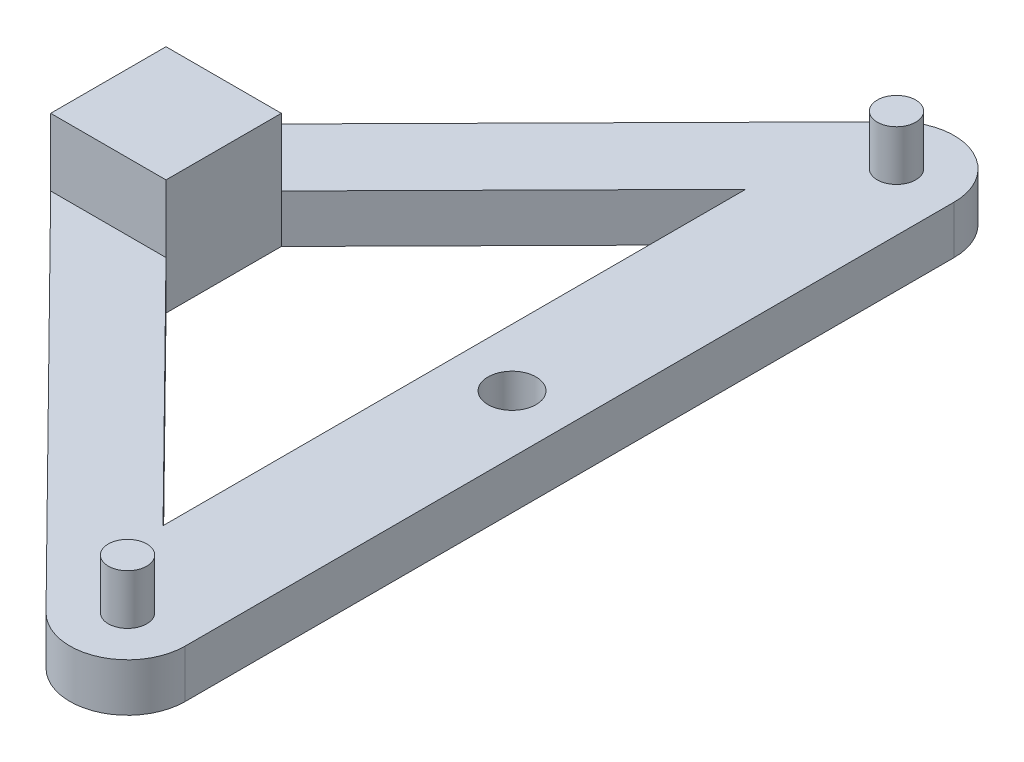
ISO-10303-21;
HEADER;
FILE_DESCRIPTION(('STEP AP214'),'2;1');
FILE_NAME('part.step','',(''),(''),'','','');
FILE_SCHEMA(('AUTOMOTIVE_DESIGN { 1 0 10303 214 1 1 1 1 }'));
ENDSEC;
DATA;
#1=APPLICATION_CONTEXT('core data for automotive mechanical design processes');
#2=APPLICATION_PROTOCOL_DEFINITION('international standard','automotive_design',2000,#1);
#3=PRODUCT_CONTEXT('',#1,'mechanical');
#4=PRODUCT('Part','Part','',(#3));
#5=PRODUCT_RELATED_PRODUCT_CATEGORY('part','',(#4));
#6=PRODUCT_DEFINITION_FORMATION('','',#4);
#7=PRODUCT_DEFINITION_CONTEXT('part definition',#1,'design');
#8=PRODUCT_DEFINITION('design','',#6,#7);
#9=PRODUCT_DEFINITION_SHAPE('','',#8);
#10=(LENGTH_UNIT() NAMED_UNIT(*) SI_UNIT(.MILLI.,.METRE.));
#11=(NAMED_UNIT(*) PLANE_ANGLE_UNIT() SI_UNIT($,.RADIAN.));
#12=(NAMED_UNIT(*) SI_UNIT($,.STERADIAN.) SOLID_ANGLE_UNIT());
#13=UNCERTAINTY_MEASURE_WITH_UNIT(LENGTH_MEASURE(1.E-05),#10,'distance_accuracy_value','');
#14=(GEOMETRIC_REPRESENTATION_CONTEXT(3) GLOBAL_UNCERTAINTY_ASSIGNED_CONTEXT((#13)) GLOBAL_UNIT_ASSIGNED_CONTEXT((#10,
#11,#12)) REPRESENTATION_CONTEXT('',''));
#15=CARTESIAN_POINT('',(0.,0.,0.));
#16=DIRECTION('',(0.,0.,1.));
#17=DIRECTION('',(1.,0.,0.));
#18=AXIS2_PLACEMENT_3D('',#15,#16,#17);
#19=CARTESIAN_POINT('',(-19.05,3.175,3.81));
#20=DIRECTION('',(-0.711608950399064,0.,0.702575762257667));
#21=DIRECTION('',(0.702575762257667,0.,0.711608950399064));
#22=AXIS2_PLACEMENT_3D('',#19,#20,#21);
#23=PLANE('',#22);
#24=DIRECTION('',(-0.702575762257667,0.,-0.711608950399064));
#25=VECTOR('',#24,1.);
#26=CARTESIAN_POINT('',(-19.05,0.,3.81));
#27=LINE('',#26,#25);
#28=CARTESIAN_POINT('',(-3.81,0.,19.245944401544));
#29=VERTEX_POINT('',#28);
#30=CARTESIAN_POINT('',(-19.05,0.,3.81));
#31=VERTEX_POINT('',#30);
#32=EDGE_CURVE('E148',#29,#31,#27,.T.);
#33=ORIENTED_EDGE('',*,*,#32,.T.);
#34=DIRECTION('',(0.,-1.,0.));
#35=VECTOR('',#34,1.);
#36=CARTESIAN_POINT('',(-19.05,3.175,3.81));
#37=LINE('',#36,#35);
#38=CARTESIAN_POINT('',(-19.05,3.175,3.81));
#39=VERTEX_POINT('',#38);
#40=EDGE_CURVE('E11',#39,#31,#37,.T.);
#41=ORIENTED_EDGE('',*,*,#40,.F.);
#42=DIRECTION('',(-0.702575762257667,0.,-0.711608950399064));
#43=VECTOR('',#42,1.);
#44=CARTESIAN_POINT('',(-19.05,3.175,3.81));
#45=LINE('',#44,#43);
#46=CARTESIAN_POINT('',(-3.81,3.175,19.245944401544));
#47=VERTEX_POINT('',#46);
#48=EDGE_CURVE('E91',#47,#39,#45,.T.);
#49=ORIENTED_EDGE('',*,*,#48,.F.);
#50=DIRECTION('',(0.,-1.,0.));
#51=VECTOR('',#50,1.);
#52=CARTESIAN_POINT('',(-3.81,3.175,19.245944401544));
#53=LINE('',#52,#51);
#54=EDGE_CURVE('E169',#47,#29,#53,.T.);
#55=ORIENTED_EDGE('',*,*,#54,.T.);
#56=EDGE_LOOP('',(#33,#41,#49,#55));
#57=FACE_BOUND('',#56,.T.);
#58=ADVANCED_FACE('F33',(#57),#23,.F.);
#59=CARTESIAN_POINT('',(-26.67,3.175,3.81));
#60=DIRECTION('',(0.711608950399064,0.,-0.702575762257667));
#61=DIRECTION('',(-0.702575762257667,0.,-0.711608950399064));
#62=AXIS2_PLACEMENT_3D('',#59,#60,#61);
#63=PLANE('',#62);
#64=DIRECTION('',(0.702575762257667,0.,0.711608950399064));
#65=VECTOR('',#64,1.);
#66=CARTESIAN_POINT('',(-26.67,0.,3.81));
#67=LINE('',#66,#65);
#68=CARTESIAN_POINT('',(-26.67,0.,3.81));
#69=VERTEX_POINT('',#68);
#70=CARTESIAN_POINT('',(-2.71123010102043,0.,28.0768136542017));
#71=VERTEX_POINT('',#70);
#72=EDGE_CURVE('E151',#69,#71,#67,.T.);
#73=ORIENTED_EDGE('',*,*,#72,.T.);
#74=DIRECTION('',(0.,-1.,0.));
#75=VECTOR('',#74,1.);
#76=CARTESIAN_POINT('',(-2.71123010102043,3.175,28.0768136542017));
#77=LINE('',#76,#75);
#78=CARTESIAN_POINT('',(-2.71123010102043,3.175,28.0768136542017));
#79=VERTEX_POINT('',#78);
#80=EDGE_CURVE('E195',#79,#71,#77,.T.);
#81=ORIENTED_EDGE('',*,*,#80,.F.);
#82=DIRECTION('',(0.702575762257667,0.,0.711608950399064));
#83=VECTOR('',#82,1.);
#84=CARTESIAN_POINT('',(-26.67,3.175,3.81));
#85=LINE('',#84,#83);
#86=CARTESIAN_POINT('',(-26.67,3.175,3.81));
#87=VERTEX_POINT('',#86);
#88=EDGE_CURVE('E160',#87,#79,#85,.T.);
#89=ORIENTED_EDGE('',*,*,#88,.F.);
#90=DIRECTION('',(0.,-1.,0.));
#91=VECTOR('',#90,1.);
#92=CARTESIAN_POINT('',(-26.67,3.175,3.81));
#93=LINE('',#92,#91);
#94=EDGE_CURVE('E41',#87,#69,#93,.T.);
#95=ORIENTED_EDGE('',*,*,#94,.T.);
#96=EDGE_LOOP('',(#73,#81,#89,#95));
#97=FACE_BOUND('',#96,.T.);
#98=ADVANCED_FACE('F202',(#97),#63,.F.);
#99=CARTESIAN_POINT('',(0.,3.175,25.4));
#100=DIRECTION('',(0.,-1.,0.));
#101=DIRECTION('',(0.,0.,-1.));
#102=AXIS2_PLACEMENT_3D('',#99,#100,#101);
#103=CYLINDRICAL_SURFACE('',#102,3.81);
#104=CARTESIAN_POINT('',(0.,0.,25.4));
#105=DIRECTION('',(0.,1.,0.));
#106=DIRECTION('',(0.,0.,1.));
#107=AXIS2_PLACEMENT_3D('',#104,#105,#106);
#108=CIRCLE('',#107,3.81);
#109=CARTESIAN_POINT('',(3.81,0.,25.4));
#110=VERTEX_POINT('',#109);
#111=EDGE_CURVE('E172',#71,#110,#108,.T.);
#112=ORIENTED_EDGE('',*,*,#111,.T.);
#113=DIRECTION('',(0.,-1.,0.));
#114=VECTOR('',#113,1.);
#115=CARTESIAN_POINT('',(3.81,3.175,25.4));
#116=LINE('',#115,#114);
#117=CARTESIAN_POINT('',(3.81,3.175,25.4));
#118=VERTEX_POINT('',#117);
#119=EDGE_CURVE('E192',#118,#110,#116,.T.);
#120=ORIENTED_EDGE('',*,*,#119,.F.);
#121=CARTESIAN_POINT('',(0.,3.175,25.4));
#122=DIRECTION('',(0.,1.,0.));
#123=DIRECTION('',(0.,0.,1.));
#124=AXIS2_PLACEMENT_3D('',#121,#122,#123);
#125=CIRCLE('',#124,3.81);
#126=EDGE_CURVE('E162',#79,#118,#125,.T.);
#127=ORIENTED_EDGE('',*,*,#126,.F.);
#128=ORIENTED_EDGE('',*,*,#80,.T.);
#129=EDGE_LOOP('',(#112,#120,#127,#128));
#130=FACE_BOUND('',#129,.T.);
#131=ADVANCED_FACE('F292',(#130),#103,.T.);
#132=CARTESIAN_POINT('',(3.81,3.175,-25.4));
#133=DIRECTION('',(-1.,0.,0.));
#134=DIRECTION('',(0.,0.,1.));
#135=AXIS2_PLACEMENT_3D('',#132,#133,#134);
#136=PLANE('',#135);
#137=DIRECTION('',(0.,0.,-1.));
#138=VECTOR('',#137,1.);
#139=CARTESIAN_POINT('',(3.81,0.,-25.4));
#140=LINE('',#139,#138);
#141=CARTESIAN_POINT('',(3.81,0.,-25.4));
#142=VERTEX_POINT('',#141);
#143=EDGE_CURVE('E174',#110,#142,#140,.T.);
#144=ORIENTED_EDGE('',*,*,#143,.T.);
#145=DIRECTION('',(0.,-1.,0.));
#146=VECTOR('',#145,1.);
#147=CARTESIAN_POINT('',(3.81,3.175,-25.4));
#148=LINE('',#147,#146);
#149=CARTESIAN_POINT('',(3.81,3.175,-25.4));
#150=VERTEX_POINT('',#149);
#151=EDGE_CURVE('E189',#150,#142,#148,.T.);
#152=ORIENTED_EDGE('',*,*,#151,.F.);
#153=DIRECTION('',(0.,0.,-1.));
#154=VECTOR('',#153,1.);
#155=CARTESIAN_POINT('',(3.81,3.175,-25.4));
#156=LINE('',#155,#154);
#157=EDGE_CURVE('E164',#118,#150,#156,.T.);
#158=ORIENTED_EDGE('',*,*,#157,.F.);
#159=ORIENTED_EDGE('',*,*,#119,.T.);
#160=EDGE_LOOP('',(#144,#152,#158,#159));
#161=FACE_BOUND('',#160,.T.);
#162=ADVANCED_FACE('F296',(#161),#136,.F.);
#163=CARTESIAN_POINT('',(0.,3.175,-25.4));
#164=DIRECTION('',(0.,-1.,0.));
#165=DIRECTION('',(0.,0.,-1.));
#166=AXIS2_PLACEMENT_3D('',#163,#164,#165);
#167=CYLINDRICAL_SURFACE('',#166,3.81);
#168=CARTESIAN_POINT('',(0.,0.,-25.4));
#169=DIRECTION('',(0.,1.,0.));
#170=DIRECTION('',(0.,0.,1.));
#171=AXIS2_PLACEMENT_3D('',#168,#169,#170);
#172=CIRCLE('',#171,3.81);
#173=CARTESIAN_POINT('',(-2.71123010102043,0.,-28.0768136542017));
#174=VERTEX_POINT('',#173);
#175=EDGE_CURVE('E176',#142,#174,#172,.T.);
#176=ORIENTED_EDGE('',*,*,#175,.T.);
#177=DIRECTION('',(0.,-1.,0.));
#178=VECTOR('',#177,1.);
#179=CARTESIAN_POINT('',(-2.71123010102043,3.175,-28.0768136542017));
#180=LINE('',#179,#178);
#181=CARTESIAN_POINT('',(-2.71123010102043,3.175,-28.0768136542017));
#182=VERTEX_POINT('',#181);
#183=EDGE_CURVE('E186',#182,#174,#180,.T.);
#184=ORIENTED_EDGE('',*,*,#183,.F.);
#185=CARTESIAN_POINT('',(0.,3.175,-25.4));
#186=DIRECTION('',(0.,1.,0.));
#187=DIRECTION('',(0.,0.,1.));
#188=AXIS2_PLACEMENT_3D('',#185,#186,#187);
#189=CIRCLE('',#188,3.81);
#190=EDGE_CURVE('E166',#150,#182,#189,.T.);
#191=ORIENTED_EDGE('',*,*,#190,.F.);
#192=ORIENTED_EDGE('',*,*,#151,.T.);
#193=EDGE_LOOP('',(#176,#184,#191,#192));
#194=FACE_BOUND('',#193,.T.);
#195=ADVANCED_FACE('F302',(#194),#167,.T.);
#196=CARTESIAN_POINT('',(-26.67,3.175,-3.81));
#197=DIRECTION('',(0.711608950399064,0.,0.702575762257667));
#198=DIRECTION('',(0.702575762257667,0.,-0.711608950399064));
#199=AXIS2_PLACEMENT_3D('',#196,#197,#198);
#200=PLANE('',#199);
#201=DIRECTION('',(-0.702575762257667,0.,0.711608950399064));
#202=VECTOR('',#201,1.);
#203=CARTESIAN_POINT('',(-26.67,0.,-3.81));
#204=LINE('',#203,#202);
#205=CARTESIAN_POINT('',(-26.67,0.,-3.81));
#206=VERTEX_POINT('',#205);
#207=EDGE_CURVE('E178',#174,#206,#204,.T.);
#208=ORIENTED_EDGE('',*,*,#207,.T.);
#209=DIRECTION('',(0.,-1.,0.));
#210=VECTOR('',#209,1.);
#211=CARTESIAN_POINT('',(-26.67,3.175,-3.81));
#212=LINE('',#211,#210);
#213=CARTESIAN_POINT('',(-26.67,3.175,-3.81));
#214=VERTEX_POINT('',#213);
#215=EDGE_CURVE('E141',#214,#206,#212,.T.);
#216=ORIENTED_EDGE('',*,*,#215,.F.);
#217=DIRECTION('',(-0.702575762257667,0.,0.711608950399064));
#218=VECTOR('',#217,1.);
#219=CARTESIAN_POINT('',(-26.67,3.175,-3.81));
#220=LINE('',#219,#218);
#221=EDGE_CURVE('E119',#182,#214,#220,.T.);
#222=ORIENTED_EDGE('',*,*,#221,.F.);
#223=ORIENTED_EDGE('',*,*,#183,.T.);
#224=EDGE_LOOP('',(#208,#216,#222,#223));
#225=FACE_BOUND('',#224,.T.);
#226=ADVANCED_FACE('F306',(#225),#200,.F.);
#227=CARTESIAN_POINT('',(-19.05,3.175,-3.81));
#228=DIRECTION('',(-0.711608950399064,0.,-0.702575762257667));
#229=DIRECTION('',(-0.702575762257668,0.,0.711608950399064));
#230=AXIS2_PLACEMENT_3D('',#227,#228,#229);
#231=PLANE('',#230);
#232=DIRECTION('',(0.702575762257667,0.,-0.711608950399064));
#233=VECTOR('',#232,1.);
#234=CARTESIAN_POINT('',(-19.05,0.,-3.81));
#235=LINE('',#234,#233);
#236=CARTESIAN_POINT('',(-19.05,0.,-3.81));
#237=VERTEX_POINT('',#236);
#238=CARTESIAN_POINT('',(-3.81,0.,-19.245944401544));
#239=VERTEX_POINT('',#238);
#240=EDGE_CURVE('E79',#237,#239,#235,.T.);
#241=ORIENTED_EDGE('',*,*,#240,.T.);
#242=DIRECTION('',(0.,-1.,0.));
#243=VECTOR('',#242,1.);
#244=CARTESIAN_POINT('',(-3.81,3.175,-19.245944401544));
#245=LINE('',#244,#243);
#246=CARTESIAN_POINT('',(-3.81,3.175,-19.245944401544));
#247=VERTEX_POINT('',#246);
#248=EDGE_CURVE('E131',#247,#239,#245,.T.);
#249=ORIENTED_EDGE('',*,*,#248,.F.);
#250=DIRECTION('',(0.702575762257667,0.,-0.711608950399064));
#251=VECTOR('',#250,1.);
#252=CARTESIAN_POINT('',(-19.05,3.175,-3.81));
#253=LINE('',#252,#251);
#254=CARTESIAN_POINT('',(-19.05,3.175,-3.81));
#255=VERTEX_POINT('',#254);
#256=EDGE_CURVE('E117',#255,#247,#253,.T.);
#257=ORIENTED_EDGE('',*,*,#256,.F.);
#258=DIRECTION('',(0.,-1.,0.));
#259=VECTOR('',#258,1.);
#260=CARTESIAN_POINT('',(-19.05,3.175,-3.81));
#261=LINE('',#260,#259);
#262=EDGE_CURVE('E129',#255,#237,#261,.T.);
#263=ORIENTED_EDGE('',*,*,#262,.T.);
#264=EDGE_LOOP('',(#241,#249,#257,#263));
#265=FACE_BOUND('',#264,.T.);
#266=ADVANCED_FACE('F127',(#265),#231,.F.);
#267=CARTESIAN_POINT('',(-3.81,3.175,-19.245944401544));
#268=DIRECTION('',(1.,0.,0.));
#269=DIRECTION('',(0.,0.,-1.));
#270=AXIS2_PLACEMENT_3D('',#267,#268,#269);
#271=PLANE('',#270);
#272=DIRECTION('',(0.,0.,1.));
#273=VECTOR('',#272,1.);
#274=CARTESIAN_POINT('',(-3.81,0.,-19.245944401544));
#275=LINE('',#274,#273);
#276=EDGE_CURVE('E85',#239,#29,#275,.T.);
#277=ORIENTED_EDGE('',*,*,#276,.T.);
#278=ORIENTED_EDGE('',*,*,#54,.F.);
#279=DIRECTION('',(0.,0.,1.));
#280=VECTOR('',#279,1.);
#281=CARTESIAN_POINT('',(-3.81,3.175,-19.245944401544));
#282=LINE('',#281,#280);
#283=EDGE_CURVE('E49',#247,#47,#282,.T.);
#284=ORIENTED_EDGE('',*,*,#283,.F.);
#285=ORIENTED_EDGE('',*,*,#248,.T.);
#286=EDGE_LOOP('',(#277,#278,#284,#285));
#287=FACE_BOUND('',#286,.T.);
#288=ADVANCED_FACE('F313',(#287),#271,.F.);
#289=CARTESIAN_POINT('',(0.,3.175,-25.4));
#290=DIRECTION('',(0.,1.,0.));
#291=DIRECTION('',(0.,0.,1.));
#292=AXIS2_PLACEMENT_3D('',#289,#290,#291);
#293=PLANE('',#292);
#294=CARTESIAN_POINT('',(0.,3.175,0.));
#295=DIRECTION('',(0.,1.,0.));
#296=DIRECTION('',(0.,0.,1.));
#297=AXIS2_PLACEMENT_3D('',#294,#295,#296);
#298=CIRCLE('',#297,1.5875);
#299=CARTESIAN_POINT('',(0.,3.175,1.5875));
#300=VERTEX_POINT('',#299);
#301=EDGE_CURVE('E261',#300,#300,#298,.T.);
#302=ORIENTED_EDGE('',*,*,#301,.F.);
#303=EDGE_LOOP('',(#302));
#304=FACE_BOUND('',#303,.T.);
#305=CARTESIAN_POINT('',(0.,3.175,-25.4));
#306=DIRECTION('',(0.,1.,0.));
#307=DIRECTION('',(0.,0.,1.));
#308=AXIS2_PLACEMENT_3D('',#305,#306,#307);
#309=CIRCLE('',#308,1.27);
#310=CARTESIAN_POINT('',(0.,3.175,-26.67));
#311=VERTEX_POINT('',#310);
#312=EDGE_CURVE('E253',#311,#311,#309,.T.);
#313=ORIENTED_EDGE('',*,*,#312,.F.);
#314=EDGE_LOOP('',(#313));
#315=FACE_BOUND('',#314,.T.);
#316=CARTESIAN_POINT('',(0.,3.175,25.4));
#317=DIRECTION('',(0.,1.,0.));
#318=DIRECTION('',(0.,0.,1.));
#319=AXIS2_PLACEMENT_3D('',#316,#317,#318);
#320=CIRCLE('',#319,1.27);
#321=CARTESIAN_POINT('',(0.,3.175,24.13));
#322=VERTEX_POINT('',#321);
#323=EDGE_CURVE('E247',#322,#322,#320,.T.);
#324=ORIENTED_EDGE('',*,*,#323,.F.);
#325=EDGE_LOOP('',(#324));
#326=FACE_BOUND('',#325,.T.);
#327=ORIENTED_EDGE('',*,*,#48,.T.);
#328=DIRECTION('',(-1.,0.,0.));
#329=VECTOR('',#328,1.);
#330=CARTESIAN_POINT('',(-26.67,3.175,3.81));
#331=LINE('',#330,#329);
#332=EDGE_CURVE('E158',#39,#87,#331,.T.);
#333=ORIENTED_EDGE('',*,*,#332,.T.);
#334=ORIENTED_EDGE('',*,*,#88,.T.);
#335=ORIENTED_EDGE('',*,*,#126,.T.);
#336=ORIENTED_EDGE('',*,*,#157,.T.);
#337=ORIENTED_EDGE('',*,*,#190,.T.);
#338=ORIENTED_EDGE('',*,*,#221,.T.);
#339=DIRECTION('',(1.,0.,0.));
#340=VECTOR('',#339,1.);
#341=CARTESIAN_POINT('',(-26.67,3.175,-3.81));
#342=LINE('',#341,#340);
#343=EDGE_CURVE('E114',#214,#255,#342,.T.);
#344=ORIENTED_EDGE('',*,*,#343,.T.);
#345=ORIENTED_EDGE('',*,*,#256,.T.);
#346=ORIENTED_EDGE('',*,*,#283,.T.);
#347=EDGE_LOOP('',(#327,#333,#334,#335,#336,#337,#338,#344,#345,#346));
#348=FACE_BOUND('',#347,.T.);
#349=ADVANCED_FACE('F116',(#304,#315,#326,#348),#293,.T.);
#350=CARTESIAN_POINT('',(0.,0.,-25.4));
#351=DIRECTION('',(0.,1.,0.));
#352=DIRECTION('',(0.,0.,1.));
#353=AXIS2_PLACEMENT_3D('',#350,#351,#352);
#354=PLANE('',#353);
#355=CARTESIAN_POINT('',(0.,0.,0.));
#356=DIRECTION('',(0.,1.,0.));
#357=DIRECTION('',(0.,0.,1.));
#358=AXIS2_PLACEMENT_3D('',#355,#356,#357);
#359=CIRCLE('',#358,1.5875);
#360=CARTESIAN_POINT('',(0.,0.,1.5875));
#361=VERTEX_POINT('',#360);
#362=EDGE_CURVE('E256',#361,#361,#359,.F.);
#363=ORIENTED_EDGE('',*,*,#362,.F.);
#364=EDGE_LOOP('',(#363));
#365=FACE_BOUND('',#364,.T.);
#366=ORIENTED_EDGE('',*,*,#240,.F.);
#367=DIRECTION('',(0.,0.,-1.));
#368=VECTOR('',#367,1.);
#369=CARTESIAN_POINT('',(-19.05,0.,3.81));
#370=LINE('',#369,#368);
#371=EDGE_CURVE('E140',#31,#237,#370,.T.);
#372=ORIENTED_EDGE('',*,*,#371,.F.);
#373=ORIENTED_EDGE('',*,*,#32,.F.);
#374=ORIENTED_EDGE('',*,*,#276,.F.);
#375=EDGE_LOOP('',(#366,#372,#373,#374));
#376=FACE_BOUND('',#375,.T.);
#377=DIRECTION('',(0.,0.,1.));
#378=VECTOR('',#377,1.);
#379=CARTESIAN_POINT('',(-26.67,0.,3.81));
#380=LINE('',#379,#378);
#381=EDGE_CURVE('E209',#206,#69,#380,.T.);
#382=ORIENTED_EDGE('',*,*,#381,.F.);
#383=ORIENTED_EDGE('',*,*,#207,.F.);
#384=ORIENTED_EDGE('',*,*,#175,.F.);
#385=ORIENTED_EDGE('',*,*,#143,.F.);
#386=ORIENTED_EDGE('',*,*,#111,.F.);
#387=ORIENTED_EDGE('',*,*,#72,.F.);
#388=EDGE_LOOP('',(#382,#383,#384,#385,#386,#387));
#389=FACE_BOUND('',#388,.T.);
#390=ADVANCED_FACE('F240',(#365,#376,#389),#354,.F.);
#391=CARTESIAN_POINT('',(-19.05,7.62,3.81));
#392=DIRECTION('',(-1.,0.,0.));
#393=DIRECTION('',(0.,0.,1.));
#394=AXIS2_PLACEMENT_3D('',#391,#392,#393);
#395=PLANE('',#394);
#396=ORIENTED_EDGE('',*,*,#371,.T.);
#397=ORIENTED_EDGE('',*,*,#262,.F.);
#398=DIRECTION('',(0.,-1.,0.));
#399=VECTOR('',#398,1.);
#400=CARTESIAN_POINT('',(-19.05,7.62,-3.81));
#401=LINE('',#400,#399);
#402=CARTESIAN_POINT('',(-19.05,7.62,-3.81));
#403=VERTEX_POINT('',#402);
#404=EDGE_CURVE('E138',#403,#255,#401,.T.);
#405=ORIENTED_EDGE('',*,*,#404,.F.);
#406=DIRECTION('',(0.,0.,-1.));
#407=VECTOR('',#406,1.);
#408=CARTESIAN_POINT('',(-19.05,7.62,3.81));
#409=LINE('',#408,#407);
#410=CARTESIAN_POINT('',(-19.05,7.62,3.81));
#411=VERTEX_POINT('',#410);
#412=EDGE_CURVE('E213',#411,#403,#409,.T.);
#413=ORIENTED_EDGE('',*,*,#412,.F.);
#414=DIRECTION('',(0.,-1.,0.));
#415=VECTOR('',#414,1.);
#416=CARTESIAN_POINT('',(-19.05,7.62,3.81));
#417=LINE('',#416,#415);
#418=EDGE_CURVE('E220',#411,#39,#417,.T.);
#419=ORIENTED_EDGE('',*,*,#418,.T.);
#420=ORIENTED_EDGE('',*,*,#40,.T.);
#421=EDGE_LOOP('',(#396,#397,#405,#413,#419,#420));
#422=FACE_BOUND('',#421,.T.);
#423=ADVANCED_FACE('F135',(#422),#395,.F.);
#424=CARTESIAN_POINT('',(-26.67,7.62,-3.81));
#425=DIRECTION('',(0.,0.,1.));
#426=DIRECTION('',(1.,0.,0.));
#427=AXIS2_PLACEMENT_3D('',#424,#425,#426);
#428=PLANE('',#427);
#429=ORIENTED_EDGE('',*,*,#343,.F.);
#430=DIRECTION('',(0.,-1.,0.));
#431=VECTOR('',#430,1.);
#432=CARTESIAN_POINT('',(-26.67,7.62,-3.81));
#433=LINE('',#432,#431);
#434=CARTESIAN_POINT('',(-26.67,7.62,-3.81));
#435=VERTEX_POINT('',#434);
#436=EDGE_CURVE('E149',#435,#214,#433,.T.);
#437=ORIENTED_EDGE('',*,*,#436,.F.);
#438=DIRECTION('',(-1.,0.,0.));
#439=VECTOR('',#438,1.);
#440=CARTESIAN_POINT('',(-26.67,7.62,-3.81));
#441=LINE('',#440,#439);
#442=EDGE_CURVE('E146',#403,#435,#441,.T.);
#443=ORIENTED_EDGE('',*,*,#442,.F.);
#444=ORIENTED_EDGE('',*,*,#404,.T.);
#445=EDGE_LOOP('',(#429,#437,#443,#444));
#446=FACE_BOUND('',#445,.T.);
#447=ADVANCED_FACE('F144',(#446),#428,.F.);
#448=CARTESIAN_POINT('',(-26.67,7.62,3.81));
#449=DIRECTION('',(1.,0.,0.));
#450=DIRECTION('',(0.,0.,-1.));
#451=AXIS2_PLACEMENT_3D('',#448,#449,#450);
#452=PLANE('',#451);
#453=CARTESIAN_POINT('',(-26.67,3.81,0.));
#454=DIRECTION('',(-1.,0.,0.));
#455=DIRECTION('',(0.,0.,1.));
#456=AXIS2_PLACEMENT_3D('',#453,#454,#455);
#457=CIRCLE('',#456,1.651);
#458=CARTESIAN_POINT('',(-26.67,3.81,1.651));
#459=VERTEX_POINT('',#458);
#460=EDGE_CURVE('E265',#459,#459,#457,.T.);
#461=ORIENTED_EDGE('',*,*,#460,.F.);
#462=EDGE_LOOP('',(#461));
#463=FACE_BOUND('',#462,.T.);
#464=ORIENTED_EDGE('',*,*,#381,.T.);
#465=ORIENTED_EDGE('',*,*,#94,.F.);
#466=DIRECTION('',(0.,-1.,0.));
#467=VECTOR('',#466,1.);
#468=CARTESIAN_POINT('',(-26.67,7.62,3.81));
#469=LINE('',#468,#467);
#470=CARTESIAN_POINT('',(-26.67,7.62,3.81));
#471=VERTEX_POINT('',#470);
#472=EDGE_CURVE('E153',#471,#87,#469,.T.);
#473=ORIENTED_EDGE('',*,*,#472,.F.);
#474=DIRECTION('',(0.,0.,1.));
#475=VECTOR('',#474,1.);
#476=CARTESIAN_POINT('',(-26.67,7.62,3.81));
#477=LINE('',#476,#475);
#478=EDGE_CURVE('E233',#435,#471,#477,.T.);
#479=ORIENTED_EDGE('',*,*,#478,.F.);
#480=ORIENTED_EDGE('',*,*,#436,.T.);
#481=ORIENTED_EDGE('',*,*,#215,.T.);
#482=EDGE_LOOP('',(#464,#465,#473,#479,#480,#481));
#483=FACE_BOUND('',#482,.T.);
#484=ADVANCED_FACE('F210',(#463,#483),#452,.F.);
#485=CARTESIAN_POINT('',(-26.67,7.62,3.81));
#486=DIRECTION('',(0.,0.,-1.));
#487=DIRECTION('',(-1.,0.,0.));
#488=AXIS2_PLACEMENT_3D('',#485,#486,#487);
#489=PLANE('',#488);
#490=ORIENTED_EDGE('',*,*,#332,.F.);
#491=ORIENTED_EDGE('',*,*,#418,.F.);
#492=DIRECTION('',(1.,0.,0.));
#493=VECTOR('',#492,1.);
#494=CARTESIAN_POINT('',(-26.67,7.62,3.81));
#495=LINE('',#494,#493);
#496=EDGE_CURVE('E222',#471,#411,#495,.T.);
#497=ORIENTED_EDGE('',*,*,#496,.F.);
#498=ORIENTED_EDGE('',*,*,#472,.T.);
#499=EDGE_LOOP('',(#490,#491,#497,#498));
#500=FACE_BOUND('',#499,.T.);
#501=ADVANCED_FACE('F226',(#500),#489,.F.);
#502=CARTESIAN_POINT('',(0.,7.62,0.));
#503=DIRECTION('',(0.,-1.,0.));
#504=DIRECTION('',(0.,0.,-1.));
#505=AXIS2_PLACEMENT_3D('',#502,#503,#504);
#506=PLANE('',#505);
#507=ORIENTED_EDGE('',*,*,#412,.T.);
#508=ORIENTED_EDGE('',*,*,#442,.T.);
#509=ORIENTED_EDGE('',*,*,#478,.T.);
#510=ORIENTED_EDGE('',*,*,#496,.T.);
#511=EDGE_LOOP('',(#507,#508,#509,#510));
#512=FACE_BOUND('',#511,.T.);
#513=ADVANCED_FACE('F243',(#512),#506,.F.);
#514=CARTESIAN_POINT('',(0.,6.477,25.4));
#515=DIRECTION('',(0.,-1.,0.));
#516=DIRECTION('',(0.,0.,-1.));
#517=AXIS2_PLACEMENT_3D('',#514,#515,#516);
#518=CYLINDRICAL_SURFACE('',#517,1.27);
#519=CARTESIAN_POINT('',(0.,6.477,25.4));
#520=DIRECTION('',(0.,1.,0.));
#521=DIRECTION('',(0.,0.,1.));
#522=AXIS2_PLACEMENT_3D('',#519,#520,#521);
#523=CIRCLE('',#522,1.27);
#524=CARTESIAN_POINT('',(0.,6.477,24.13));
#525=VERTEX_POINT('',#524);
#526=EDGE_CURVE('E216',#525,#525,#523,.T.);
#527=CARTESIAN_POINT('',(0.,6.477,24.13));
#528=CARTESIAN_POINT('',(0.,6.44260416666667,24.13));
#529=CARTESIAN_POINT('',(0.,6.40820833333333,24.13));
#530=CARTESIAN_POINT('',(0.,6.33941666666667,24.13));
#531=CARTESIAN_POINT('',(0.,6.30502083333333,24.13));
#532=CARTESIAN_POINT('',(0.,6.23622916666667,24.13));
#533=CARTESIAN_POINT('',(0.,6.20183333333333,24.13));
#534=CARTESIAN_POINT('',(0.,6.13304166666667,24.13));
#535=CARTESIAN_POINT('',(0.,6.09864583333333,24.13));
#536=CARTESIAN_POINT('',(0.,6.02985416666667,24.13));
#537=CARTESIAN_POINT('',(0.,5.99545833333333,24.13));
#538=CARTESIAN_POINT('',(0.,5.92666666666667,24.13));
#539=CARTESIAN_POINT('',(0.,5.89227083333333,24.13));
#540=CARTESIAN_POINT('',(0.,5.82347916666667,24.13));
#541=CARTESIAN_POINT('',(0.,5.78908333333333,24.13));
#542=CARTESIAN_POINT('',(0.,5.72029166666667,24.13));
#543=CARTESIAN_POINT('',(0.,5.68589583333333,24.13));
#544=CARTESIAN_POINT('',(0.,5.61710416666667,24.13));
#545=CARTESIAN_POINT('',(0.,5.58270833333333,24.13));
#546=CARTESIAN_POINT('',(0.,5.51391666666667,24.13));
#547=CARTESIAN_POINT('',(0.,5.47952083333333,24.13));
#548=CARTESIAN_POINT('',(0.,5.41072916666667,24.13));
#549=CARTESIAN_POINT('',(0.,5.37633333333333,24.13));
#550=CARTESIAN_POINT('',(0.,5.30754166666667,24.13));
#551=CARTESIAN_POINT('',(0.,5.27314583333333,24.13));
#552=CARTESIAN_POINT('',(0.,5.20435416666667,24.13));
#553=CARTESIAN_POINT('',(0.,5.16995833333333,24.13));
#554=CARTESIAN_POINT('',(0.,5.10116666666667,24.13));
#555=CARTESIAN_POINT('',(0.,5.06677083333333,24.13));
#556=CARTESIAN_POINT('',(0.,4.99797916666667,24.13));
#557=CARTESIAN_POINT('',(0.,4.96358333333333,24.13));
#558=CARTESIAN_POINT('',(0.,4.89479166666667,24.13));
#559=CARTESIAN_POINT('',(0.,4.86039583333333,24.13));
#560=CARTESIAN_POINT('',(0.,4.79160416666667,24.13));
#561=CARTESIAN_POINT('',(0.,4.75720833333333,24.13));
#562=CARTESIAN_POINT('',(0.,4.68841666666667,24.13));
#563=CARTESIAN_POINT('',(0.,4.65402083333333,24.13));
#564=CARTESIAN_POINT('',(0.,4.58522916666667,24.13));
#565=CARTESIAN_POINT('',(0.,4.55083333333333,24.13));
#566=CARTESIAN_POINT('',(0.,4.48204166666667,24.13));
#567=CARTESIAN_POINT('',(0.,4.44764583333333,24.13));
#568=CARTESIAN_POINT('',(0.,4.37885416666667,24.13));
#569=CARTESIAN_POINT('',(0.,4.34445833333333,24.13));
#570=CARTESIAN_POINT('',(0.,4.27566666666667,24.13));
#571=CARTESIAN_POINT('',(0.,4.24127083333333,24.13));
#572=CARTESIAN_POINT('',(0.,4.17247916666667,24.13));
#573=CARTESIAN_POINT('',(0.,4.13808333333333,24.13));
#574=CARTESIAN_POINT('',(0.,4.06929166666667,24.13));
#575=CARTESIAN_POINT('',(0.,4.03489583333333,24.13));
#576=CARTESIAN_POINT('',(0.,3.96610416666667,24.13));
#577=CARTESIAN_POINT('',(0.,3.93170833333333,24.13));
#578=CARTESIAN_POINT('',(0.,3.86291666666667,24.13));
#579=CARTESIAN_POINT('',(0.,3.82852083333333,24.13));
#580=CARTESIAN_POINT('',(0.,3.75972916666667,24.13));
#581=CARTESIAN_POINT('',(0.,3.72533333333333,24.13));
#582=CARTESIAN_POINT('',(0.,3.65654166666667,24.13));
#583=CARTESIAN_POINT('',(0.,3.62214583333333,24.13));
#584=CARTESIAN_POINT('',(0.,3.55335416666667,24.13));
#585=CARTESIAN_POINT('',(0.,3.51895833333333,24.13));
#586=CARTESIAN_POINT('',(0.,3.45016666666667,24.13));
#587=CARTESIAN_POINT('',(0.,3.41577083333333,24.13));
#588=CARTESIAN_POINT('',(0.,3.34697916666667,24.13));
#589=CARTESIAN_POINT('',(0.,3.31258333333333,24.13));
#590=CARTESIAN_POINT('',(0.,3.24379166666667,24.13));
#591=CARTESIAN_POINT('',(0.,3.20939583333333,24.13));
#592=CARTESIAN_POINT('',(0.,3.175,24.13));
#593=B_SPLINE_CURVE_WITH_KNOTS('',3,(#527,#528,#529,#530,#531,#532,#533,#534,#535,#536,#537,
#538,#539,#540,#541,#542,#543,#544,#545,#546,#547,#548,#549,#550,#551,#552,#553,#554,#555,#556,
#557,#558,#559,#560,#561,#562,#563,#564,#565,#566,#567,#568,#569,#570,#571,#572,#573,#574,#575,
#576,#577,#578,#579,#580,#581,#582,#583,#584,#585,#586,#587,#588,#589,#590,#591,#592),
.UNSPECIFIED.,.F.,.F.,(4,2,2,2,2,2,2,2,2,2,2,2,2,2,2,2,2,2,2,2,2,2,2,2,2,2,2,2,2,2,2,2,4),(0.,
0.103187500000001,0.206375000000001,0.309562500000001,0.412750000000001,0.515937500000001,
0.619125000000001,0.722312500000001,0.825500000000001,0.928687500000001,1.031875,1.1350625,
1.23825,1.3414375,1.444625,1.5478125,1.651,1.7541875,1.857375,1.9605625,2.06375,2.1669375,
2.270125,2.3733125,2.4765,2.5796875,2.682875,2.7860625,2.88925,2.9924375,3.095625,3.1988125,
3.302),.UNSPECIFIED.);
#594=EDGE_CURVE('BSEAM348',#525,#322,#593,.T.);
#595=ORIENTED_EDGE('',*,*,#526,.F.);
#596=ORIENTED_EDGE('',*,*,#323,.T.);
#597=ORIENTED_EDGE('',*,*,#594,.T.);
#598=ORIENTED_EDGE('',*,*,#594,.F.);
#599=EDGE_LOOP('',(#595,#597,#596,#598));
#600=FACE_BOUND('',#599,.T.);
#601=ADVANCED_FACE('F348',(#600),#518,.T.);
#602=CARTESIAN_POINT('',(0.,6.477,25.4));
#603=DIRECTION('',(0.,1.,0.));
#604=DIRECTION('',(0.,0.,1.));
#605=AXIS2_PLACEMENT_3D('',#602,#603,#604);
#606=PLANE('',#605);
#607=ORIENTED_EDGE('',*,*,#526,.T.);
#608=EDGE_LOOP('',(#607));
#609=FACE_BOUND('',#608,.T.);
#610=ADVANCED_FACE('F357',(#609),#606,.T.);
#611=CARTESIAN_POINT('',(0.,6.477,-25.4));
#612=DIRECTION('',(0.,-1.,0.));
#613=DIRECTION('',(0.,0.,-1.));
#614=AXIS2_PLACEMENT_3D('',#611,#612,#613);
#615=CYLINDRICAL_SURFACE('',#614,1.27);
#616=CARTESIAN_POINT('',(0.,6.477,-25.4));
#617=DIRECTION('',(0.,1.,0.));
#618=DIRECTION('',(0.,0.,1.));
#619=AXIS2_PLACEMENT_3D('',#616,#617,#618);
#620=CIRCLE('',#619,1.27);
#621=CARTESIAN_POINT('',(0.,6.477,-26.67));
#622=VERTEX_POINT('',#621);
#623=EDGE_CURVE('E250',#622,#622,#620,.T.);
#624=CARTESIAN_POINT('',(0.,6.477,-26.67));
#625=CARTESIAN_POINT('',(0.,6.44260416666667,-26.67));
#626=CARTESIAN_POINT('',(0.,6.40820833333333,-26.67));
#627=CARTESIAN_POINT('',(0.,6.33941666666667,-26.67));
#628=CARTESIAN_POINT('',(0.,6.30502083333333,-26.67));
#629=CARTESIAN_POINT('',(0.,6.23622916666667,-26.67));
#630=CARTESIAN_POINT('',(0.,6.20183333333333,-26.67));
#631=CARTESIAN_POINT('',(0.,6.13304166666667,-26.67));
#632=CARTESIAN_POINT('',(0.,6.09864583333333,-26.67));
#633=CARTESIAN_POINT('',(0.,6.02985416666667,-26.67));
#634=CARTESIAN_POINT('',(0.,5.99545833333333,-26.67));
#635=CARTESIAN_POINT('',(0.,5.92666666666667,-26.67));
#636=CARTESIAN_POINT('',(0.,5.89227083333333,-26.67));
#637=CARTESIAN_POINT('',(0.,5.82347916666667,-26.67));
#638=CARTESIAN_POINT('',(0.,5.78908333333333,-26.67));
#639=CARTESIAN_POINT('',(0.,5.72029166666667,-26.67));
#640=CARTESIAN_POINT('',(0.,5.68589583333333,-26.67));
#641=CARTESIAN_POINT('',(0.,5.61710416666667,-26.67));
#642=CARTESIAN_POINT('',(0.,5.58270833333333,-26.67));
#643=CARTESIAN_POINT('',(0.,5.51391666666667,-26.67));
#644=CARTESIAN_POINT('',(0.,5.47952083333333,-26.67));
#645=CARTESIAN_POINT('',(0.,5.41072916666667,-26.67));
#646=CARTESIAN_POINT('',(0.,5.37633333333333,-26.67));
#647=CARTESIAN_POINT('',(0.,5.30754166666667,-26.67));
#648=CARTESIAN_POINT('',(0.,5.27314583333333,-26.67));
#649=CARTESIAN_POINT('',(0.,5.20435416666667,-26.67));
#650=CARTESIAN_POINT('',(0.,5.16995833333333,-26.67));
#651=CARTESIAN_POINT('',(0.,5.10116666666667,-26.67));
#652=CARTESIAN_POINT('',(0.,5.06677083333333,-26.67));
#653=CARTESIAN_POINT('',(0.,4.99797916666667,-26.67));
#654=CARTESIAN_POINT('',(0.,4.96358333333333,-26.67));
#655=CARTESIAN_POINT('',(0.,4.89479166666667,-26.67));
#656=CARTESIAN_POINT('',(0.,4.86039583333333,-26.67));
#657=CARTESIAN_POINT('',(0.,4.79160416666667,-26.67));
#658=CARTESIAN_POINT('',(0.,4.75720833333333,-26.67));
#659=CARTESIAN_POINT('',(0.,4.68841666666667,-26.67));
#660=CARTESIAN_POINT('',(0.,4.65402083333333,-26.67));
#661=CARTESIAN_POINT('',(0.,4.58522916666667,-26.67));
#662=CARTESIAN_POINT('',(0.,4.55083333333333,-26.67));
#663=CARTESIAN_POINT('',(0.,4.48204166666667,-26.67));
#664=CARTESIAN_POINT('',(0.,4.44764583333333,-26.67));
#665=CARTESIAN_POINT('',(0.,4.37885416666667,-26.67));
#666=CARTESIAN_POINT('',(0.,4.34445833333333,-26.67));
#667=CARTESIAN_POINT('',(0.,4.27566666666667,-26.67));
#668=CARTESIAN_POINT('',(0.,4.24127083333333,-26.67));
#669=CARTESIAN_POINT('',(0.,4.17247916666667,-26.67));
#670=CARTESIAN_POINT('',(0.,4.13808333333333,-26.67));
#671=CARTESIAN_POINT('',(0.,4.06929166666667,-26.67));
#672=CARTESIAN_POINT('',(0.,4.03489583333333,-26.67));
#673=CARTESIAN_POINT('',(0.,3.96610416666667,-26.67));
#674=CARTESIAN_POINT('',(0.,3.93170833333333,-26.67));
#675=CARTESIAN_POINT('',(0.,3.86291666666667,-26.67));
#676=CARTESIAN_POINT('',(0.,3.82852083333333,-26.67));
#677=CARTESIAN_POINT('',(0.,3.75972916666667,-26.67));
#678=CARTESIAN_POINT('',(0.,3.72533333333333,-26.67));
#679=CARTESIAN_POINT('',(0.,3.65654166666667,-26.67));
#680=CARTESIAN_POINT('',(0.,3.62214583333333,-26.67));
#681=CARTESIAN_POINT('',(0.,3.55335416666667,-26.67));
#682=CARTESIAN_POINT('',(0.,3.51895833333333,-26.67));
#683=CARTESIAN_POINT('',(0.,3.45016666666667,-26.67));
#684=CARTESIAN_POINT('',(0.,3.41577083333333,-26.67));
#685=CARTESIAN_POINT('',(0.,3.34697916666667,-26.67));
#686=CARTESIAN_POINT('',(0.,3.31258333333333,-26.67));
#687=CARTESIAN_POINT('',(0.,3.24379166666667,-26.67));
#688=CARTESIAN_POINT('',(0.,3.20939583333333,-26.67));
#689=CARTESIAN_POINT('',(0.,3.175,-26.67));
#690=B_SPLINE_CURVE_WITH_KNOTS('',3,(#624,#625,#626,#627,#628,#629,#630,#631,#632,#633,#634,
#635,#636,#637,#638,#639,#640,#641,#642,#643,#644,#645,#646,#647,#648,#649,#650,#651,#652,#653,
#654,#655,#656,#657,#658,#659,#660,#661,#662,#663,#664,#665,#666,#667,#668,#669,#670,#671,#672,
#673,#674,#675,#676,#677,#678,#679,#680,#681,#682,#683,#684,#685,#686,#687,#688,#689),
.UNSPECIFIED.,.F.,.F.,(4,2,2,2,2,2,2,2,2,2,2,2,2,2,2,2,2,2,2,2,2,2,2,2,2,2,2,2,2,2,2,2,4),(0.,
0.103187500000001,0.206375000000001,0.309562500000001,0.412750000000001,0.515937500000001,
0.619125000000001,0.722312500000001,0.825500000000001,0.928687500000001,1.031875,1.1350625,
1.23825,1.3414375,1.444625,1.5478125,1.651,1.7541875,1.857375,1.9605625,2.06375,2.1669375,
2.270125,2.3733125,2.4765,2.5796875,2.682875,2.7860625,2.88925,2.9924375,3.095625,3.1988125,
3.302),.UNSPECIFIED.);
#691=EDGE_CURVE('BSEAM367',#622,#311,#690,.T.);
#692=ORIENTED_EDGE('',*,*,#623,.F.);
#693=ORIENTED_EDGE('',*,*,#312,.T.);
#694=ORIENTED_EDGE('',*,*,#691,.T.);
#695=ORIENTED_EDGE('',*,*,#691,.F.);
#696=EDGE_LOOP('',(#692,#694,#693,#695));
#697=FACE_BOUND('',#696,.T.);
#698=ADVANCED_FACE('F367',(#697),#615,.T.);
#699=CARTESIAN_POINT('',(0.,6.477,-25.4));
#700=DIRECTION('',(0.,1.,0.));
#701=DIRECTION('',(0.,0.,1.));
#702=AXIS2_PLACEMENT_3D('',#699,#700,#701);
#703=PLANE('',#702);
#704=ORIENTED_EDGE('',*,*,#623,.T.);
#705=EDGE_LOOP('',(#704));
#706=FACE_BOUND('',#705,.T.);
#707=ADVANCED_FACE('F377',(#706),#703,.T.);
#708=CARTESIAN_POINT('',(0.,-4.49012806053458,0.));
#709=DIRECTION('',(0.,1.,0.));
#710=DIRECTION('',(0.,0.,1.));
#711=AXIS2_PLACEMENT_3D('',#708,#709,#710);
#712=CYLINDRICAL_SURFACE('',#711,1.5875);
#713=CARTESIAN_POINT('',(0.,0.,1.5875));
#714=CARTESIAN_POINT('',(0.,0.0330729166666659,1.5875));
#715=CARTESIAN_POINT('',(0.,0.0661458333333327,1.5875));
#716=CARTESIAN_POINT('',(0.,0.132291666666666,1.5875));
#717=CARTESIAN_POINT('',(0.,0.165364583333332,1.5875));
#718=CARTESIAN_POINT('',(0.,0.231510416666666,1.5875));
#719=CARTESIAN_POINT('',(0.,0.264583333333333,1.5875));
#720=CARTESIAN_POINT('',(0.,0.330729166666666,1.5875));
#721=CARTESIAN_POINT('',(0.,0.363802083333332,1.5875));
#722=CARTESIAN_POINT('',(0.,0.429947916666666,1.5875));
#723=CARTESIAN_POINT('',(0.,0.463020833333332,1.5875));
#724=CARTESIAN_POINT('',(0.,0.529166666666666,1.5875));
#725=CARTESIAN_POINT('',(0.,0.562239583333333,1.5875));
#726=CARTESIAN_POINT('',(0.,0.628385416666666,1.5875));
#727=CARTESIAN_POINT('',(0.,0.661458333333332,1.5875));
#728=CARTESIAN_POINT('',(0.,0.727604166666666,1.5875));
#729=CARTESIAN_POINT('',(0.,0.760677083333333,1.5875));
#730=CARTESIAN_POINT('',(0.,0.826822916666666,1.5875));
#731=CARTESIAN_POINT('',(0.,0.859895833333333,1.5875));
#732=CARTESIAN_POINT('',(0.,0.926041666666666,1.5875));
#733=CARTESIAN_POINT('',(0.,0.959114583333333,1.5875));
#734=CARTESIAN_POINT('',(0.,1.02526041666667,1.5875));
#735=CARTESIAN_POINT('',(0.,1.05833333333333,1.5875));
#736=CARTESIAN_POINT('',(0.,1.12447916666667,1.5875));
#737=CARTESIAN_POINT('',(0.,1.15755208333333,1.5875));
#738=CARTESIAN_POINT('',(0.,1.22369791666667,1.5875));
#739=CARTESIAN_POINT('',(0.,1.25677083333333,1.5875));
#740=CARTESIAN_POINT('',(0.,1.32291666666667,1.5875));
#741=CARTESIAN_POINT('',(0.,1.35598958333333,1.5875));
#742=CARTESIAN_POINT('',(0.,1.42213541666667,1.5875));
#743=CARTESIAN_POINT('',(0.,1.45520833333333,1.5875));
#744=CARTESIAN_POINT('',(0.,1.52135416666667,1.5875));
#745=CARTESIAN_POINT('',(0.,1.55442708333333,1.5875));
#746=CARTESIAN_POINT('',(0.,1.62057291666667,1.5875));
#747=CARTESIAN_POINT('',(0.,1.65364583333333,1.5875));
#748=CARTESIAN_POINT('',(0.,1.71979166666667,1.5875));
#749=CARTESIAN_POINT('',(0.,1.75286458333333,1.5875));
#750=CARTESIAN_POINT('',(0.,1.81901041666667,1.5875));
#751=CARTESIAN_POINT('',(0.,1.85208333333333,1.5875));
#752=CARTESIAN_POINT('',(0.,1.91822916666667,1.5875));
#753=CARTESIAN_POINT('',(0.,1.95130208333333,1.5875));
#754=CARTESIAN_POINT('',(0.,2.01744791666667,1.5875));
#755=CARTESIAN_POINT('',(0.,2.05052083333333,1.5875));
#756=CARTESIAN_POINT('',(0.,2.11666666666667,1.5875));
#757=CARTESIAN_POINT('',(0.,2.14973958333333,1.5875));
#758=CARTESIAN_POINT('',(0.,2.21588541666667,1.5875));
#759=CARTESIAN_POINT('',(0.,2.24895833333333,1.5875));
#760=CARTESIAN_POINT('',(0.,2.31510416666667,1.5875));
#761=CARTESIAN_POINT('',(0.,2.34817708333333,1.5875));
#762=CARTESIAN_POINT('',(0.,2.41432291666667,1.5875));
#763=CARTESIAN_POINT('',(0.,2.44739583333333,1.5875));
#764=CARTESIAN_POINT('',(0.,2.51354166666667,1.5875));
#765=CARTESIAN_POINT('',(0.,2.54661458333333,1.5875));
#766=CARTESIAN_POINT('',(0.,2.61276041666667,1.5875));
#767=CARTESIAN_POINT('',(0.,2.64583333333333,1.5875));
#768=CARTESIAN_POINT('',(0.,2.71197916666667,1.5875));
#769=CARTESIAN_POINT('',(0.,2.74505208333333,1.5875));
#770=CARTESIAN_POINT('',(0.,2.81119791666667,1.5875));
#771=CARTESIAN_POINT('',(0.,2.84427083333333,1.5875));
#772=CARTESIAN_POINT('',(0.,2.91041666666667,1.5875));
#773=CARTESIAN_POINT('',(0.,2.94348958333333,1.5875));
#774=CARTESIAN_POINT('',(0.,3.00963541666667,1.5875));
#775=CARTESIAN_POINT('',(0.,3.04270833333333,1.5875));
#776=CARTESIAN_POINT('',(0.,3.10885416666667,1.5875));
#777=CARTESIAN_POINT('',(0.,3.14192708333333,1.5875));
#778=CARTESIAN_POINT('',(0.,3.175,1.5875));
#779=B_SPLINE_CURVE_WITH_KNOTS('',3,(#713,#714,#715,#716,#717,#718,#719,#720,#721,#722,#723,
#724,#725,#726,#727,#728,#729,#730,#731,#732,#733,#734,#735,#736,#737,#738,#739,#740,#741,#742,
#743,#744,#745,#746,#747,#748,#749,#750,#751,#752,#753,#754,#755,#756,#757,#758,#759,#760,#761,
#762,#763,#764,#765,#766,#767,#768,#769,#770,#771,#772,#773,#774,#775,#776,#777,#778),
.UNSPECIFIED.,.F.,.F.,(4,2,2,2,2,2,2,2,2,2,2,2,2,2,2,2,2,2,2,2,2,2,2,2,2,2,2,2,2,2,2,2,4),(0.,
0.0992187500000004,0.1984375,0.29765625,0.396875,0.49609375,0.5953125,0.69453125,0.79375,
0.892968750000001,0.9921875,1.09140625,1.190625,1.28984375,1.3890625,1.48828125,1.5875,
1.68671875,1.7859375,1.88515625,1.984375,2.08359375,2.1828125,2.28203125,2.38125,2.48046875,
2.5796875,2.67890625,2.778125,2.87734375,2.9765625,3.07578125,3.175),.UNSPECIFIED.);
#780=EDGE_CURVE('BSEAM276',#361,#300,#779,.T.);
#781=ORIENTED_EDGE('',*,*,#362,.T.);
#782=ORIENTED_EDGE('',*,*,#301,.T.);
#783=ORIENTED_EDGE('',*,*,#780,.T.);
#784=ORIENTED_EDGE('',*,*,#780,.F.);
#785=EDGE_LOOP('',(#781,#783,#782,#784));
#786=FACE_BOUND('',#785,.T.);
#787=ADVANCED_FACE('F276',(#786),#712,.F.);
#788=CARTESIAN_POINT('',(-22.86,3.81,0.));
#789=DIRECTION('',(-1.,0.,0.));
#790=DIRECTION('',(0.,0.,1.));
#791=AXIS2_PLACEMENT_3D('',#788,#789,#790);
#792=CYLINDRICAL_SURFACE('',#791,1.651);
#793=CARTESIAN_POINT('',(-22.86,3.81,0.));
#794=DIRECTION('',(-1.,0.,0.));
#795=DIRECTION('',(0.,0.,1.));
#796=AXIS2_PLACEMENT_3D('',#793,#794,#795);
#797=CIRCLE('',#796,1.651);
#798=CARTESIAN_POINT('',(-22.86,3.81,1.651));
#799=VERTEX_POINT('',#798);
#800=EDGE_CURVE('E264',#799,#799,#797,.T.);
#801=CARTESIAN_POINT('',(-22.86,3.81,1.651));
#802=CARTESIAN_POINT('',(-22.8996875,3.81,1.651));
#803=CARTESIAN_POINT('',(-22.939375,3.81,1.651));
#804=CARTESIAN_POINT('',(-23.01875,3.81,1.651));
#805=CARTESIAN_POINT('',(-23.0584375,3.81,1.651));
#806=CARTESIAN_POINT('',(-23.1378125,3.81,1.651));
#807=CARTESIAN_POINT('',(-23.1775,3.81,1.651));
#808=CARTESIAN_POINT('',(-23.256875,3.81,1.651));
#809=CARTESIAN_POINT('',(-23.2965625,3.81,1.651));
#810=CARTESIAN_POINT('',(-23.3759375,3.81,1.651));
#811=CARTESIAN_POINT('',(-23.415625,3.81,1.651));
#812=CARTESIAN_POINT('',(-23.495,3.81,1.651));
#813=CARTESIAN_POINT('',(-23.5346875,3.81,1.651));
#814=CARTESIAN_POINT('',(-23.6140625,3.81,1.651));
#815=CARTESIAN_POINT('',(-23.65375,3.81,1.651));
#816=CARTESIAN_POINT('',(-23.733125,3.81,1.651));
#817=CARTESIAN_POINT('',(-23.7728125,3.81,1.651));
#818=CARTESIAN_POINT('',(-23.8521875,3.81,1.651));
#819=CARTESIAN_POINT('',(-23.891875,3.81,1.651));
#820=CARTESIAN_POINT('',(-23.97125,3.81,1.651));
#821=CARTESIAN_POINT('',(-24.0109375,3.81,1.651));
#822=CARTESIAN_POINT('',(-24.0903125,3.81,1.651));
#823=CARTESIAN_POINT('',(-24.13,3.81,1.651));
#824=CARTESIAN_POINT('',(-24.209375,3.81,1.651));
#825=CARTESIAN_POINT('',(-24.2490625,3.81,1.651));
#826=CARTESIAN_POINT('',(-24.3284375,3.81,1.651));
#827=CARTESIAN_POINT('',(-24.368125,3.81,1.651));
#828=CARTESIAN_POINT('',(-24.4475,3.81,1.651));
#829=CARTESIAN_POINT('',(-24.4871875,3.81,1.651));
#830=CARTESIAN_POINT('',(-24.5665625,3.81,1.651));
#831=CARTESIAN_POINT('',(-24.60625,3.81,1.651));
#832=CARTESIAN_POINT('',(-24.685625,3.81,1.651));
#833=CARTESIAN_POINT('',(-24.7253125,3.81,1.651));
#834=CARTESIAN_POINT('',(-24.8046875,3.81,1.651));
#835=CARTESIAN_POINT('',(-24.844375,3.81,1.651));
#836=CARTESIAN_POINT('',(-24.92375,3.81,1.651));
#837=CARTESIAN_POINT('',(-24.9634375,3.81,1.651));
#838=CARTESIAN_POINT('',(-25.0428125,3.81,1.651));
#839=CARTESIAN_POINT('',(-25.0825,3.81,1.651));
#840=CARTESIAN_POINT('',(-25.161875,3.81,1.651));
#841=CARTESIAN_POINT('',(-25.2015625,3.81,1.651));
#842=CARTESIAN_POINT('',(-25.2809375,3.81,1.651));
#843=CARTESIAN_POINT('',(-25.320625,3.81,1.651));
#844=CARTESIAN_POINT('',(-25.4,3.81,1.651));
#845=CARTESIAN_POINT('',(-25.4396875,3.81,1.651));
#846=CARTESIAN_POINT('',(-25.5190625,3.81,1.651));
#847=CARTESIAN_POINT('',(-25.55875,3.81,1.651));
#848=CARTESIAN_POINT('',(-25.638125,3.81,1.651));
#849=CARTESIAN_POINT('',(-25.6778125,3.81,1.651));
#850=CARTESIAN_POINT('',(-25.7571875,3.81,1.651));
#851=CARTESIAN_POINT('',(-25.796875,3.81,1.651));
#852=CARTESIAN_POINT('',(-25.87625,3.81,1.651));
#853=CARTESIAN_POINT('',(-25.9159375,3.81,1.651));
#854=CARTESIAN_POINT('',(-25.9953125,3.81,1.651));
#855=CARTESIAN_POINT('',(-26.035,3.81,1.651));
#856=CARTESIAN_POINT('',(-26.114375,3.81,1.651));
#857=CARTESIAN_POINT('',(-26.1540625,3.81,1.651));
#858=CARTESIAN_POINT('',(-26.2334375,3.81,1.651));
#859=CARTESIAN_POINT('',(-26.273125,3.81,1.651));
#860=CARTESIAN_POINT('',(-26.3525,3.81,1.651));
#861=CARTESIAN_POINT('',(-26.3921875,3.81,1.651));
#862=CARTESIAN_POINT('',(-26.4715625,3.81,1.651));
#863=CARTESIAN_POINT('',(-26.51125,3.81,1.651));
#864=CARTESIAN_POINT('',(-26.590625,3.81,1.651));
#865=CARTESIAN_POINT('',(-26.6303125,3.81,1.651));
#866=CARTESIAN_POINT('',(-26.67,3.81,1.651));
#867=B_SPLINE_CURVE_WITH_KNOTS('',3,(#801,#802,#803,#804,#805,#806,#807,#808,#809,#810,#811,
#812,#813,#814,#815,#816,#817,#818,#819,#820,#821,#822,#823,#824,#825,#826,#827,#828,#829,#830,
#831,#832,#833,#834,#835,#836,#837,#838,#839,#840,#841,#842,#843,#844,#845,#846,#847,#848,#849,
#850,#851,#852,#853,#854,#855,#856,#857,#858,#859,#860,#861,#862,#863,#864,#865,#866),
.UNSPECIFIED.,.F.,.F.,(4,2,2,2,2,2,2,2,2,2,2,2,2,2,2,2,2,2,2,2,2,2,2,2,2,2,2,2,2,2,2,2,4),(0.,
0.119062500000003,0.238125000000002,0.357187500000002,0.476250000000001,0.5953125,
0.714375000000003,0.833437500000003,0.952500000000002,1.0715625,1.190625,1.3096875,1.42875,
1.5478125,1.666875,1.7859375,1.905,2.0240625,2.143125,2.2621875,2.38125,2.5003125,2.619375,
2.7384375,2.8575,2.9765625,3.095625,3.2146875,3.33375,3.4528125,3.571875,3.6909375,3.81),.UNSPECIFIED.);
#868=EDGE_CURVE('BSEAM273',#799,#459,#867,.T.);
#869=ORIENTED_EDGE('',*,*,#800,.F.);
#870=ORIENTED_EDGE('',*,*,#460,.T.);
#871=ORIENTED_EDGE('',*,*,#868,.T.);
#872=ORIENTED_EDGE('',*,*,#868,.F.);
#873=EDGE_LOOP('',(#869,#871,#870,#872));
#874=FACE_BOUND('',#873,.T.);
#875=ADVANCED_FACE('F273',(#874),#792,.F.);
#876=CARTESIAN_POINT('',(-22.86,3.81,0.));
#877=DIRECTION('',(-1.,0.,0.));
#878=DIRECTION('',(0.,0.,1.));
#879=AXIS2_PLACEMENT_3D('',#876,#877,#878);
#880=PLANE('',#879);
#881=ORIENTED_EDGE('',*,*,#800,.T.);
#882=EDGE_LOOP('',(#881));
#883=FACE_BOUND('',#882,.T.);
#884=ADVANCED_FACE('F271',(#883),#880,.T.);
#885=CLOSED_SHELL('',(#58,#98,#131,#162,#195,#226,#266,#288,#349,#390,#423,#447,#484,#501,#513,
#601,#610,#698,#707,#787,#875,#884));
#886=MANIFOLD_SOLID_BREP('B2',#885);
#887=ADVANCED_BREP_SHAPE_REPRESENTATION('',(#18,#886),#14);
#888=SHAPE_DEFINITION_REPRESENTATION(#9,#887);
ENDSEC;
END-ISO-10303-21;
